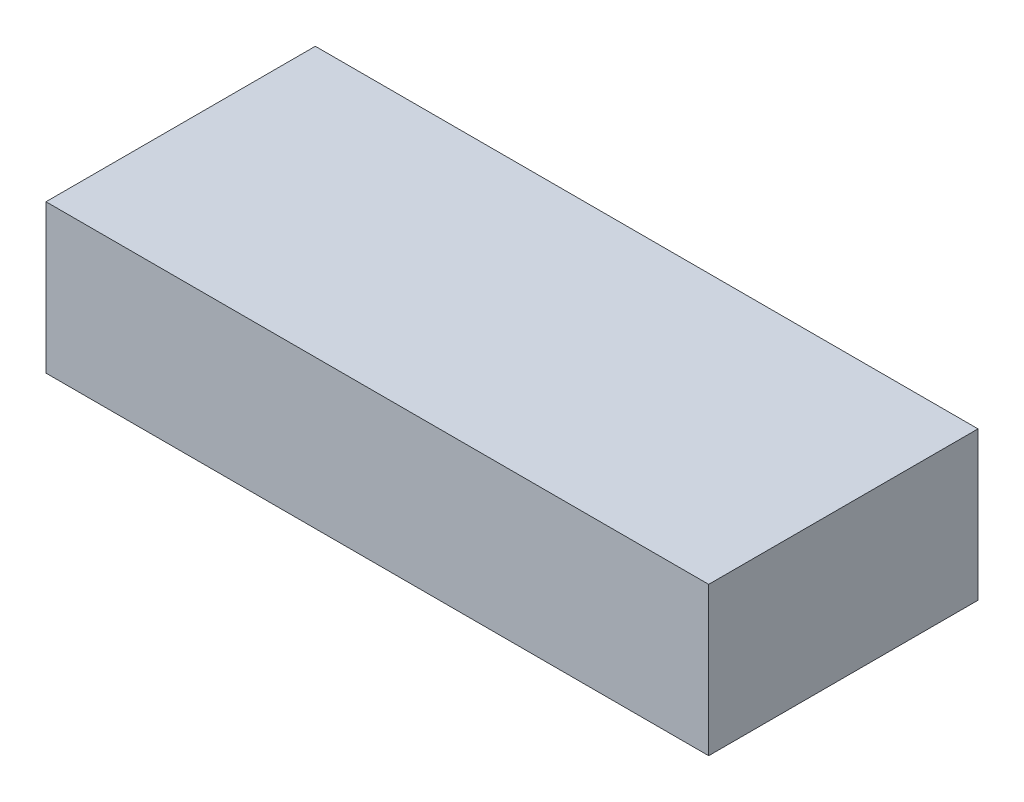
ISO-10303-21;
HEADER;
FILE_DESCRIPTION(('STEP AP214'),'2;1');
FILE_NAME('part.step','',(''),(''),'','','');
FILE_SCHEMA(('AUTOMOTIVE_DESIGN { 1 0 10303 214 1 1 1 1 }'));
ENDSEC;
DATA;
#1=APPLICATION_CONTEXT('core data for automotive mechanical design processes');
#2=APPLICATION_PROTOCOL_DEFINITION('international standard','automotive_design',2000,#1);
#3=PRODUCT_CONTEXT('',#1,'mechanical');
#4=PRODUCT('Part','Part','',(#3));
#5=PRODUCT_RELATED_PRODUCT_CATEGORY('part','',(#4));
#6=PRODUCT_DEFINITION_FORMATION('','',#4);
#7=PRODUCT_DEFINITION_CONTEXT('part definition',#1,'design');
#8=PRODUCT_DEFINITION('design','',#6,#7);
#9=PRODUCT_DEFINITION_SHAPE('','',#8);
#10=(LENGTH_UNIT() NAMED_UNIT(*) SI_UNIT(.MILLI.,.METRE.));
#11=(NAMED_UNIT(*) PLANE_ANGLE_UNIT() SI_UNIT($,.RADIAN.));
#12=(NAMED_UNIT(*) SI_UNIT($,.STERADIAN.) SOLID_ANGLE_UNIT());
#13=UNCERTAINTY_MEASURE_WITH_UNIT(LENGTH_MEASURE(1.E-05),#10,'distance_accuracy_value','');
#14=(GEOMETRIC_REPRESENTATION_CONTEXT(3) GLOBAL_UNCERTAINTY_ASSIGNED_CONTEXT((#13)) GLOBAL_UNIT_ASSIGNED_CONTEXT((#10,
#11,#12)) REPRESENTATION_CONTEXT('',''));
#15=CARTESIAN_POINT('',(0.,0.,0.));
#16=DIRECTION('',(0.,0.,1.));
#17=DIRECTION('',(1.,0.,0.));
#18=AXIS2_PLACEMENT_3D('',#15,#16,#17);
#19=CARTESIAN_POINT('',(126.,93.,-47.));
#20=DIRECTION('',(0.,1.,0.));
#21=DIRECTION('',(0.,0.,-1.));
#22=AXIS2_PLACEMENT_3D('',#19,#20,#21);
#23=PLANE('',#22);
#24=DIRECTION('',(1.,0.,0.));
#25=VECTOR('',#24,1.);
#26=CARTESIAN_POINT('',(94.75,93.,-34.3));
#27=LINE('',#26,#25);
#28=CARTESIAN_POINT('',(94.75,93.,-34.3));
#29=VERTEX_POINT('',#28);
#30=CARTESIAN_POINT('',(157.25,93.,-34.3));
#31=VERTEX_POINT('',#30);
#32=EDGE_CURVE('E83',#29,#31,#27,.T.);
#33=ORIENTED_EDGE('',*,*,#32,.T.);
#34=DIRECTION('',(0.,0.,-1.));
#35=VECTOR('',#34,1.);
#36=CARTESIAN_POINT('',(157.25,93.,-34.3));
#37=LINE('',#36,#35);
#38=CARTESIAN_POINT('',(157.25,93.,-59.7));
#39=VERTEX_POINT('',#38);
#40=EDGE_CURVE('E103',#31,#39,#37,.T.);
#41=ORIENTED_EDGE('',*,*,#40,.T.);
#42=DIRECTION('',(-1.,0.,0.));
#43=VECTOR('',#42,1.);
#44=CARTESIAN_POINT('',(157.25,93.,-59.7));
#45=LINE('',#44,#43);
#46=CARTESIAN_POINT('',(94.75,93.,-59.7));
#47=VERTEX_POINT('',#46);
#48=EDGE_CURVE('E74',#39,#47,#45,.T.);
#49=ORIENTED_EDGE('',*,*,#48,.T.);
#50=DIRECTION('',(0.,0.,1.));
#51=VECTOR('',#50,1.);
#52=CARTESIAN_POINT('',(94.75,93.,-59.7));
#53=LINE('',#52,#51);
#54=EDGE_CURVE('E11',#47,#29,#53,.T.);
#55=ORIENTED_EDGE('',*,*,#54,.T.);
#56=EDGE_LOOP('',(#33,#41,#49,#55));
#57=FACE_BOUND('',#56,.T.);
#58=ADVANCED_FACE('F17',(#57),#23,.T.);
#59=CARTESIAN_POINT('',(126.,79.,-47.));
#60=DIRECTION('',(0.,1.,0.));
#61=DIRECTION('',(0.,0.,-1.));
#62=AXIS2_PLACEMENT_3D('',#59,#60,#61);
#63=PLANE('',#62);
#64=DIRECTION('',(0.,0.,1.));
#65=VECTOR('',#64,1.);
#66=CARTESIAN_POINT('',(94.75,79.,-59.7));
#67=LINE('',#66,#65);
#68=CARTESIAN_POINT('',(94.75,79.,-59.7));
#69=VERTEX_POINT('',#68);
#70=CARTESIAN_POINT('',(94.75,79.,-34.3));
#71=VERTEX_POINT('',#70);
#72=EDGE_CURVE('E27',#69,#71,#67,.T.);
#73=ORIENTED_EDGE('',*,*,#72,.F.);
#74=DIRECTION('',(-1.,0.,0.));
#75=VECTOR('',#74,1.);
#76=CARTESIAN_POINT('',(157.25,79.,-59.7));
#77=LINE('',#76,#75);
#78=CARTESIAN_POINT('',(157.25,79.,-59.7));
#79=VERTEX_POINT('',#78);
#80=EDGE_CURVE('E110',#79,#69,#77,.T.);
#81=ORIENTED_EDGE('',*,*,#80,.F.);
#82=DIRECTION('',(0.,0.,-1.));
#83=VECTOR('',#82,1.);
#84=CARTESIAN_POINT('',(157.25,79.,-34.3));
#85=LINE('',#84,#83);
#86=CARTESIAN_POINT('',(157.25,79.,-34.3));
#87=VERTEX_POINT('',#86);
#88=EDGE_CURVE('E84',#87,#79,#85,.T.);
#89=ORIENTED_EDGE('',*,*,#88,.F.);
#90=DIRECTION('',(1.,0.,0.));
#91=VECTOR('',#90,1.);
#92=CARTESIAN_POINT('',(94.75,79.,-34.3));
#93=LINE('',#92,#91);
#94=EDGE_CURVE('E81',#71,#87,#93,.T.);
#95=ORIENTED_EDGE('',*,*,#94,.F.);
#96=EDGE_LOOP('',(#73,#81,#89,#95));
#97=FACE_BOUND('',#96,.T.);
#98=ADVANCED_FACE('F19',(#97),#63,.F.);
#99=CARTESIAN_POINT('',(94.75,79.,-59.7));
#100=DIRECTION('',(1.,0.,0.));
#101=DIRECTION('',(0.,1.,0.));
#102=AXIS2_PLACEMENT_3D('',#99,#100,#101);
#103=PLANE('',#102);
#104=ORIENTED_EDGE('',*,*,#72,.T.);
#105=DIRECTION('',(0.,1.,0.));
#106=VECTOR('',#105,1.);
#107=CARTESIAN_POINT('',(94.75,79.,-34.3));
#108=LINE('',#107,#106);
#109=EDGE_CURVE('E67',#71,#29,#108,.T.);
#110=ORIENTED_EDGE('',*,*,#109,.T.);
#111=ORIENTED_EDGE('',*,*,#54,.F.);
#112=DIRECTION('',(0.,1.,0.));
#113=VECTOR('',#112,1.);
#114=CARTESIAN_POINT('',(94.75,79.,-59.7));
#115=LINE('',#114,#113);
#116=EDGE_CURVE('E71',#69,#47,#115,.T.);
#117=ORIENTED_EDGE('',*,*,#116,.F.);
#118=EDGE_LOOP('',(#104,#110,#111,#117));
#119=FACE_BOUND('',#118,.T.);
#120=ADVANCED_FACE('F68',(#119),#103,.F.);
#121=CARTESIAN_POINT('',(157.25,79.,-59.7));
#122=DIRECTION('',(0.,0.,1.));
#123=DIRECTION('',(0.,-1.,0.));
#124=AXIS2_PLACEMENT_3D('',#121,#122,#123);
#125=PLANE('',#124);
#126=ORIENTED_EDGE('',*,*,#80,.T.);
#127=ORIENTED_EDGE('',*,*,#116,.T.);
#128=ORIENTED_EDGE('',*,*,#48,.F.);
#129=DIRECTION('',(0.,1.,0.));
#130=VECTOR('',#129,1.);
#131=CARTESIAN_POINT('',(157.25,79.,-59.7));
#132=LINE('',#131,#130);
#133=EDGE_CURVE('E105',#79,#39,#132,.T.);
#134=ORIENTED_EDGE('',*,*,#133,.F.);
#135=EDGE_LOOP('',(#126,#127,#128,#134));
#136=FACE_BOUND('',#135,.T.);
#137=ADVANCED_FACE('F120',(#136),#125,.F.);
#138=CARTESIAN_POINT('',(157.25,79.,-34.3));
#139=DIRECTION('',(-1.,0.,0.));
#140=DIRECTION('',(0.,0.,1.));
#141=AXIS2_PLACEMENT_3D('',#138,#139,#140);
#142=PLANE('',#141);
#143=ORIENTED_EDGE('',*,*,#88,.T.);
#144=ORIENTED_EDGE('',*,*,#133,.T.);
#145=ORIENTED_EDGE('',*,*,#40,.F.);
#146=DIRECTION('',(0.,1.,0.));
#147=VECTOR('',#146,1.);
#148=CARTESIAN_POINT('',(157.25,79.,-34.3));
#149=LINE('',#148,#147);
#150=EDGE_CURVE('E89',#87,#31,#149,.T.);
#151=ORIENTED_EDGE('',*,*,#150,.F.);
#152=EDGE_LOOP('',(#143,#144,#145,#151));
#153=FACE_BOUND('',#152,.T.);
#154=ADVANCED_FACE('F125',(#153),#142,.F.);
#155=CARTESIAN_POINT('',(94.75,79.,-34.3));
#156=DIRECTION('',(0.,0.,-1.));
#157=DIRECTION('',(-1.,0.,0.));
#158=AXIS2_PLACEMENT_3D('',#155,#156,#157);
#159=PLANE('',#158);
#160=ORIENTED_EDGE('',*,*,#94,.T.);
#161=ORIENTED_EDGE('',*,*,#150,.T.);
#162=ORIENTED_EDGE('',*,*,#32,.F.);
#163=ORIENTED_EDGE('',*,*,#109,.F.);
#164=EDGE_LOOP('',(#160,#161,#162,#163));
#165=FACE_BOUND('',#164,.T.);
#166=ADVANCED_FACE('F78',(#165),#159,.F.);
#167=CLOSED_SHELL('',(#58,#98,#120,#137,#154,#166));
#168=MANIFOLD_SOLID_BREP('B1',#167);
#169=ADVANCED_BREP_SHAPE_REPRESENTATION('',(#18,#168),#14);
#170=SHAPE_DEFINITION_REPRESENTATION(#9,#169);
ENDSEC;
END-ISO-10303-21;
